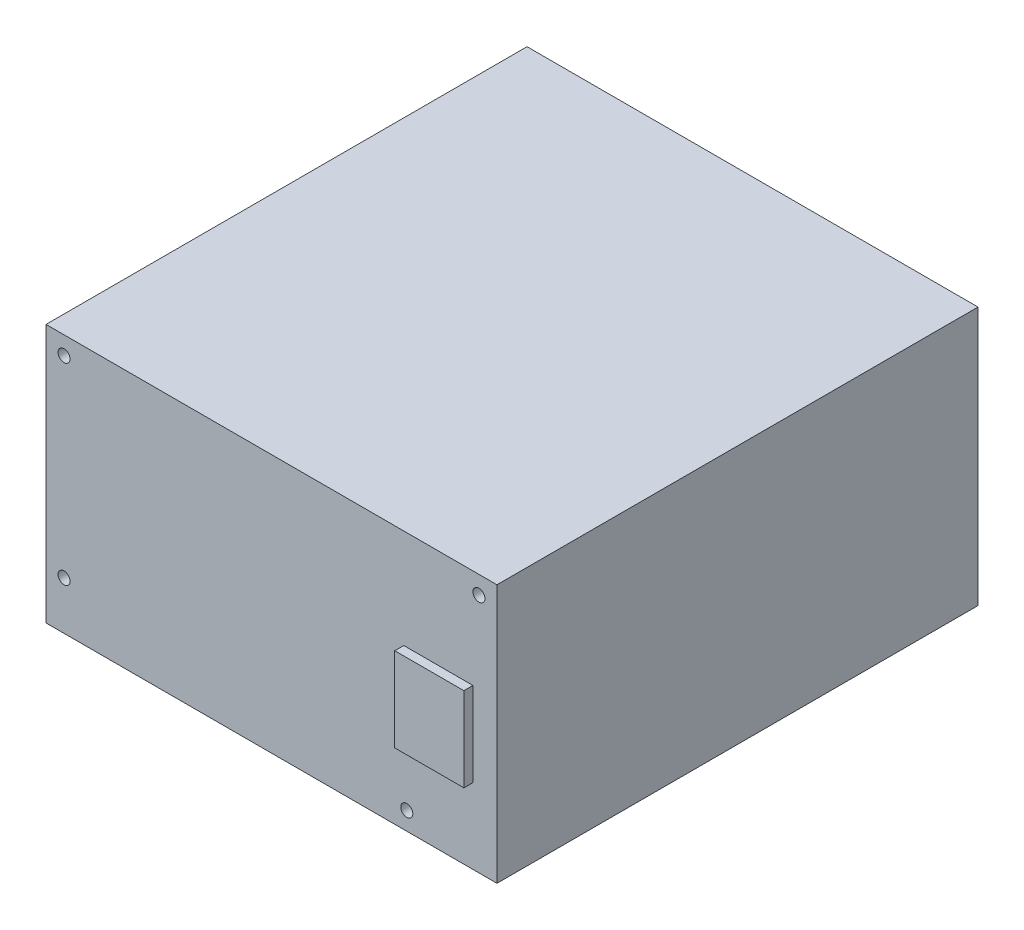
ISO-10303-21;
HEADER;
FILE_DESCRIPTION(('STEP AP214'),'2;1');
FILE_NAME('part.step','',(''),(''),'','','');
FILE_SCHEMA(('AUTOMOTIVE_DESIGN { 1 0 10303 214 1 1 1 1 }'));
ENDSEC;
DATA;
#1=APPLICATION_CONTEXT('core data for automotive mechanical design processes');
#2=APPLICATION_PROTOCOL_DEFINITION('international standard','automotive_design',2000,#1);
#3=PRODUCT_CONTEXT('',#1,'mechanical');
#4=PRODUCT('Part','Part','',(#3));
#5=PRODUCT_RELATED_PRODUCT_CATEGORY('part','',(#4));
#6=PRODUCT_DEFINITION_FORMATION('','',#4);
#7=PRODUCT_DEFINITION_CONTEXT('part definition',#1,'design');
#8=PRODUCT_DEFINITION('design','',#6,#7);
#9=PRODUCT_DEFINITION_SHAPE('','',#8);
#10=(LENGTH_UNIT() NAMED_UNIT(*) SI_UNIT(.MILLI.,.METRE.));
#11=(NAMED_UNIT(*) PLANE_ANGLE_UNIT() SI_UNIT($,.RADIAN.));
#12=(NAMED_UNIT(*) SI_UNIT($,.STERADIAN.) SOLID_ANGLE_UNIT());
#13=UNCERTAINTY_MEASURE_WITH_UNIT(LENGTH_MEASURE(1.E-05),#10,'distance_accuracy_value','');
#14=(GEOMETRIC_REPRESENTATION_CONTEXT(3) GLOBAL_UNCERTAINTY_ASSIGNED_CONTEXT((#13)) GLOBAL_UNIT_ASSIGNED_CONTEXT((#10,
#11,#12)) REPRESENTATION_CONTEXT('',''));
#15=CARTESIAN_POINT('',(0.,0.,0.));
#16=DIRECTION('',(0.,0.,1.));
#17=DIRECTION('',(1.,0.,0.));
#18=AXIS2_PLACEMENT_3D('',#15,#16,#17);
#19=CARTESIAN_POINT('',(150.,86.,0.));
#20=DIRECTION('',(0.,0.,-1.));
#21=DIRECTION('',(-1.,0.,0.));
#22=AXIS2_PLACEMENT_3D('',#19,#20,#21);
#23=PLANE('',#22);
#24=CARTESIAN_POINT('',(6.,16.,0.));
#25=DIRECTION('',(0.,0.,1.));
#26=DIRECTION('',(1.,0.,0.));
#27=AXIS2_PLACEMENT_3D('',#24,#25,#26);
#28=CIRCLE('',#27,2.);
#29=CARTESIAN_POINT('',(8.,16.,0.));
#30=VERTEX_POINT('',#29);
#31=EDGE_CURVE('E273',#30,#30,#28,.T.);
#32=ORIENTED_EDGE('',*,*,#31,.F.);
#33=EDGE_LOOP('',(#32));
#34=FACE_BOUND('',#33,.T.);
#35=DIRECTION('',(0.,-1.,0.));
#36=VECTOR('',#35,1.);
#37=CARTESIAN_POINT('',(119.,25.,0.));
#38=LINE('',#37,#36);
#39=CARTESIAN_POINT('',(119.,53.,0.));
#40=VERTEX_POINT('',#39);
#41=CARTESIAN_POINT('',(119.,25.,0.));
#42=VERTEX_POINT('',#41);
#43=EDGE_CURVE('E132',#40,#42,#38,.T.);
#44=ORIENTED_EDGE('',*,*,#43,.F.);
#45=DIRECTION('',(-1.,0.,0.));
#46=VECTOR('',#45,1.);
#47=CARTESIAN_POINT('',(142.,53.,0.));
#48=LINE('',#47,#46);
#49=CARTESIAN_POINT('',(142.,53.,0.));
#50=VERTEX_POINT('',#49);
#51=EDGE_CURVE('E129',#50,#40,#48,.T.);
#52=ORIENTED_EDGE('',*,*,#51,.F.);
#53=DIRECTION('',(0.,1.,0.));
#54=VECTOR('',#53,1.);
#55=CARTESIAN_POINT('',(142.,25.,0.));
#56=LINE('',#55,#54);
#57=CARTESIAN_POINT('',(142.,25.,0.));
#58=VERTEX_POINT('',#57);
#59=EDGE_CURVE('E65',#58,#50,#56,.T.);
#60=ORIENTED_EDGE('',*,*,#59,.F.);
#61=DIRECTION('',(1.,0.,0.));
#62=VECTOR('',#61,1.);
#63=CARTESIAN_POINT('',(142.,25.,0.));
#64=LINE('',#63,#62);
#65=EDGE_CURVE('E60',#42,#58,#64,.T.);
#66=ORIENTED_EDGE('',*,*,#65,.F.);
#67=EDGE_LOOP('',(#44,#52,#60,#66));
#68=FACE_BOUND('',#67,.T.);
#69=DIRECTION('',(1.,0.,0.));
#70=VECTOR('',#69,1.);
#71=CARTESIAN_POINT('',(150.,0.,0.));
#72=LINE('',#71,#70);
#73=CARTESIAN_POINT('',(0.,0.,0.));
#74=VERTEX_POINT('',#73);
#75=CARTESIAN_POINT('',(150.,0.,0.));
#76=VERTEX_POINT('',#75);
#77=EDGE_CURVE('E150',#74,#76,#72,.T.);
#78=ORIENTED_EDGE('',*,*,#77,.T.);
#79=DIRECTION('',(0.,-1.,0.));
#80=VECTOR('',#79,1.);
#81=CARTESIAN_POINT('',(150.,86.,0.));
#82=LINE('',#81,#80);
#83=CARTESIAN_POINT('',(150.,86.,0.));
#84=VERTEX_POINT('',#83);
#85=EDGE_CURVE('E158',#84,#76,#82,.T.);
#86=ORIENTED_EDGE('',*,*,#85,.F.);
#87=DIRECTION('',(1.,0.,0.));
#88=VECTOR('',#87,1.);
#89=CARTESIAN_POINT('',(150.,86.,0.));
#90=LINE('',#89,#88);
#91=CARTESIAN_POINT('',(0.,86.,0.));
#92=VERTEX_POINT('',#91);
#93=EDGE_CURVE('E156',#92,#84,#90,.T.);
#94=ORIENTED_EDGE('',*,*,#93,.F.);
#95=DIRECTION('',(0.,-1.,0.));
#96=VECTOR('',#95,1.);
#97=CARTESIAN_POINT('',(0.,86.,0.));
#98=LINE('',#97,#96);
#99=EDGE_CURVE('E170',#92,#74,#98,.T.);
#100=ORIENTED_EDGE('',*,*,#99,.T.);
#101=EDGE_LOOP('',(#78,#86,#94,#100));
#102=FACE_BOUND('',#101,.T.);
#103=CARTESIAN_POINT('',(6.00000000000001,80.,0.));
#104=DIRECTION('',(0.,0.,-1.));
#105=DIRECTION('',(-1.,0.,0.));
#106=AXIS2_PLACEMENT_3D('',#103,#104,#105);
#107=CIRCLE('',#106,2.);
#108=CARTESIAN_POINT('',(4.00000000000001,80.,0.));
#109=VERTEX_POINT('',#108);
#110=EDGE_CURVE('E270',#109,#109,#107,.T.);
#111=ORIENTED_EDGE('',*,*,#110,.T.);
#112=EDGE_LOOP('',(#111));
#113=FACE_BOUND('',#112,.T.);
#114=CARTESIAN_POINT('',(120.,6.,0.));
#115=DIRECTION('',(0.,0.,1.));
#116=DIRECTION('',(1.,0.,0.));
#117=AXIS2_PLACEMENT_3D('',#114,#115,#116);
#118=CIRCLE('',#117,2.);
#119=CARTESIAN_POINT('',(122.,6.,0.));
#120=VERTEX_POINT('',#119);
#121=EDGE_CURVE('E289',#120,#120,#118,.T.);
#122=ORIENTED_EDGE('',*,*,#121,.F.);
#123=EDGE_LOOP('',(#122));
#124=FACE_BOUND('',#123,.T.);
#125=CARTESIAN_POINT('',(144.,80.,0.));
#126=DIRECTION('',(0.,0.,1.));
#127=DIRECTION('',(1.,0.,0.));
#128=AXIS2_PLACEMENT_3D('',#125,#126,#127);
#129=CIRCLE('',#128,2.);
#130=CARTESIAN_POINT('',(146.,80.,0.));
#131=VERTEX_POINT('',#130);
#132=EDGE_CURVE('E264',#131,#131,#129,.T.);
#133=ORIENTED_EDGE('',*,*,#132,.F.);
#134=EDGE_LOOP('',(#133));
#135=FACE_BOUND('',#134,.T.);
#136=ADVANCED_FACE('F44',(#34,#68,#102,#113,#124,#135),#23,.F.);
#137=CARTESIAN_POINT('',(150.,86.,-160.));
#138=DIRECTION('',(-1.,0.,0.));
#139=DIRECTION('',(0.,0.,1.));
#140=AXIS2_PLACEMENT_3D('',#137,#138,#139);
#141=PLANE('',#140);
#142=DIRECTION('',(0.,0.,-1.));
#143=VECTOR('',#142,1.);
#144=CARTESIAN_POINT('',(150.,0.,-160.));
#145=LINE('',#144,#143);
#146=CARTESIAN_POINT('',(150.,0.,-160.));
#147=VERTEX_POINT('',#146);
#148=EDGE_CURVE('E134',#76,#147,#145,.T.);
#149=ORIENTED_EDGE('',*,*,#148,.T.);
#150=DIRECTION('',(0.,-1.,0.));
#151=VECTOR('',#150,1.);
#152=CARTESIAN_POINT('',(150.,86.,-160.));
#153=LINE('',#152,#151);
#154=CARTESIAN_POINT('',(150.,86.,-160.));
#155=VERTEX_POINT('',#154);
#156=EDGE_CURVE('E11',#155,#147,#153,.T.);
#157=ORIENTED_EDGE('',*,*,#156,.F.);
#158=DIRECTION('',(0.,0.,-1.));
#159=VECTOR('',#158,1.);
#160=CARTESIAN_POINT('',(150.,86.,-160.));
#161=LINE('',#160,#159);
#162=EDGE_CURVE('E145',#84,#155,#161,.T.);
#163=ORIENTED_EDGE('',*,*,#162,.F.);
#164=ORIENTED_EDGE('',*,*,#85,.T.);
#165=EDGE_LOOP('',(#149,#157,#163,#164));
#166=FACE_BOUND('',#165,.T.);
#167=ADVANCED_FACE('F46',(#166),#141,.F.);
#168=CARTESIAN_POINT('',(150.,86.,-160.));
#169=DIRECTION('',(0.,0.,1.));
#170=DIRECTION('',(1.,0.,0.));
#171=AXIS2_PLACEMENT_3D('',#168,#169,#170);
#172=PLANE('',#171);
#173=DIRECTION('',(-1.,0.,0.));
#174=VECTOR('',#173,1.);
#175=CARTESIAN_POINT('',(150.,0.,-160.));
#176=LINE('',#175,#174);
#177=CARTESIAN_POINT('',(0.,0.,-160.));
#178=VERTEX_POINT('',#177);
#179=EDGE_CURVE('E139',#147,#178,#176,.T.);
#180=ORIENTED_EDGE('',*,*,#179,.T.);
#181=DIRECTION('',(0.,-1.,0.));
#182=VECTOR('',#181,1.);
#183=CARTESIAN_POINT('',(0.,86.,-160.));
#184=LINE('',#183,#182);
#185=CARTESIAN_POINT('',(0.,86.,-160.));
#186=VERTEX_POINT('',#185);
#187=EDGE_CURVE('E53',#186,#178,#184,.T.);
#188=ORIENTED_EDGE('',*,*,#187,.F.);
#189=DIRECTION('',(-1.,0.,0.));
#190=VECTOR('',#189,1.);
#191=CARTESIAN_POINT('',(150.,86.,-160.));
#192=LINE('',#191,#190);
#193=EDGE_CURVE('E149',#155,#186,#192,.T.);
#194=ORIENTED_EDGE('',*,*,#193,.F.);
#195=ORIENTED_EDGE('',*,*,#156,.T.);
#196=EDGE_LOOP('',(#180,#188,#194,#195));
#197=FACE_BOUND('',#196,.T.);
#198=ADVANCED_FACE('F195',(#197),#172,.F.);
#199=CARTESIAN_POINT('',(0.,86.,-160.));
#200=DIRECTION('',(1.,0.,0.));
#201=DIRECTION('',(0.,0.,-1.));
#202=AXIS2_PLACEMENT_3D('',#199,#200,#201);
#203=PLANE('',#202);
#204=DIRECTION('',(0.,0.,1.));
#205=VECTOR('',#204,1.);
#206=CARTESIAN_POINT('',(0.,0.,-160.));
#207=LINE('',#206,#205);
#208=EDGE_CURVE('E162',#178,#74,#207,.T.);
#209=ORIENTED_EDGE('',*,*,#208,.T.);
#210=ORIENTED_EDGE('',*,*,#99,.F.);
#211=DIRECTION('',(0.,0.,1.));
#212=VECTOR('',#211,1.);
#213=CARTESIAN_POINT('',(0.,86.,-160.));
#214=LINE('',#213,#212);
#215=EDGE_CURVE('E153',#186,#92,#214,.T.);
#216=ORIENTED_EDGE('',*,*,#215,.F.);
#217=ORIENTED_EDGE('',*,*,#187,.T.);
#218=EDGE_LOOP('',(#209,#210,#216,#217));
#219=FACE_BOUND('',#218,.T.);
#220=ADVANCED_FACE('F179',(#219),#203,.F.);
#221=CARTESIAN_POINT('',(0.,86.,0.));
#222=DIRECTION('',(0.,-1.,0.));
#223=DIRECTION('',(0.,0.,-1.));
#224=AXIS2_PLACEMENT_3D('',#221,#222,#223);
#225=PLANE('',#224);
#226=ORIENTED_EDGE('',*,*,#162,.T.);
#227=ORIENTED_EDGE('',*,*,#193,.T.);
#228=ORIENTED_EDGE('',*,*,#215,.T.);
#229=ORIENTED_EDGE('',*,*,#93,.T.);
#230=EDGE_LOOP('',(#226,#227,#228,#229));
#231=FACE_BOUND('',#230,.T.);
#232=ADVANCED_FACE('F194',(#231),#225,.F.);
#233=CARTESIAN_POINT('',(0.,0.,0.));
#234=DIRECTION('',(0.,-1.,0.));
#235=DIRECTION('',(0.,0.,-1.));
#236=AXIS2_PLACEMENT_3D('',#233,#234,#235);
#237=PLANE('',#236);
#238=ORIENTED_EDGE('',*,*,#148,.F.);
#239=ORIENTED_EDGE('',*,*,#77,.F.);
#240=ORIENTED_EDGE('',*,*,#208,.F.);
#241=ORIENTED_EDGE('',*,*,#179,.F.);
#242=EDGE_LOOP('',(#238,#239,#240,#241));
#243=FACE_BOUND('',#242,.T.);
#244=ADVANCED_FACE('F185',(#243),#237,.T.);
#245=CARTESIAN_POINT('',(119.,25.,3.));
#246=DIRECTION('',(1.,0.,0.));
#247=DIRECTION('',(0.,0.,-1.));
#248=AXIS2_PLACEMENT_3D('',#245,#246,#247);
#249=PLANE('',#248);
#250=ORIENTED_EDGE('',*,*,#43,.T.);
#251=DIRECTION('',(0.,0.,-1.));
#252=VECTOR('',#251,1.);
#253=CARTESIAN_POINT('',(119.,25.,3.));
#254=LINE('',#253,#252);
#255=CARTESIAN_POINT('',(119.,25.,3.));
#256=VERTEX_POINT('',#255);
#257=EDGE_CURVE('E111',#256,#42,#254,.T.);
#258=ORIENTED_EDGE('',*,*,#257,.F.);
#259=DIRECTION('',(0.,-1.,0.));
#260=VECTOR('',#259,1.);
#261=CARTESIAN_POINT('',(119.,25.,3.));
#262=LINE('',#261,#260);
#263=CARTESIAN_POINT('',(119.,53.,3.));
#264=VERTEX_POINT('',#263);
#265=EDGE_CURVE('E119',#264,#256,#262,.T.);
#266=ORIENTED_EDGE('',*,*,#265,.F.);
#267=DIRECTION('',(0.,0.,-1.));
#268=VECTOR('',#267,1.);
#269=CARTESIAN_POINT('',(119.,53.,3.));
#270=LINE('',#269,#268);
#271=EDGE_CURVE('E299',#264,#40,#270,.T.);
#272=ORIENTED_EDGE('',*,*,#271,.T.);
#273=EDGE_LOOP('',(#250,#258,#266,#272));
#274=FACE_BOUND('',#273,.T.);
#275=ADVANCED_FACE('F131',(#274),#249,.F.);
#276=CARTESIAN_POINT('',(142.,25.,3.));
#277=DIRECTION('',(0.,1.,0.));
#278=DIRECTION('',(0.,0.,1.));
#279=AXIS2_PLACEMENT_3D('',#276,#277,#278);
#280=PLANE('',#279);
#281=ORIENTED_EDGE('',*,*,#65,.T.);
#282=DIRECTION('',(0.,0.,-1.));
#283=VECTOR('',#282,1.);
#284=CARTESIAN_POINT('',(142.,25.,3.));
#285=LINE('',#284,#283);
#286=CARTESIAN_POINT('',(142.,25.,3.));
#287=VERTEX_POINT('',#286);
#288=EDGE_CURVE('E114',#287,#58,#285,.T.);
#289=ORIENTED_EDGE('',*,*,#288,.F.);
#290=DIRECTION('',(1.,0.,0.));
#291=VECTOR('',#290,1.);
#292=CARTESIAN_POINT('',(142.,25.,3.));
#293=LINE('',#292,#291);
#294=EDGE_CURVE('E107',#256,#287,#293,.T.);
#295=ORIENTED_EDGE('',*,*,#294,.F.);
#296=ORIENTED_EDGE('',*,*,#257,.T.);
#297=EDGE_LOOP('',(#281,#289,#295,#296));
#298=FACE_BOUND('',#297,.T.);
#299=ADVANCED_FACE('F109',(#298),#280,.F.);
#300=CARTESIAN_POINT('',(142.,25.,3.));
#301=DIRECTION('',(-1.,0.,0.));
#302=DIRECTION('',(0.,0.,1.));
#303=AXIS2_PLACEMENT_3D('',#300,#301,#302);
#304=PLANE('',#303);
#305=ORIENTED_EDGE('',*,*,#59,.T.);
#306=DIRECTION('',(0.,0.,-1.));
#307=VECTOR('',#306,1.);
#308=CARTESIAN_POINT('',(142.,53.,3.));
#309=LINE('',#308,#307);
#310=CARTESIAN_POINT('',(142.,53.,3.));
#311=VERTEX_POINT('',#310);
#312=EDGE_CURVE('E141',#311,#50,#309,.T.);
#313=ORIENTED_EDGE('',*,*,#312,.F.);
#314=DIRECTION('',(0.,1.,0.));
#315=VECTOR('',#314,1.);
#316=CARTESIAN_POINT('',(142.,25.,3.));
#317=LINE('',#316,#315);
#318=EDGE_CURVE('E118',#287,#311,#317,.T.);
#319=ORIENTED_EDGE('',*,*,#318,.F.);
#320=ORIENTED_EDGE('',*,*,#288,.T.);
#321=EDGE_LOOP('',(#305,#313,#319,#320));
#322=FACE_BOUND('',#321,.T.);
#323=ADVANCED_FACE('F219',(#322),#304,.F.);
#324=CARTESIAN_POINT('',(142.,53.,3.));
#325=DIRECTION('',(0.,-1.,0.));
#326=DIRECTION('',(1.,0.,0.));
#327=AXIS2_PLACEMENT_3D('',#324,#325,#326);
#328=PLANE('',#327);
#329=ORIENTED_EDGE('',*,*,#51,.T.);
#330=ORIENTED_EDGE('',*,*,#271,.F.);
#331=DIRECTION('',(-1.,0.,0.));
#332=VECTOR('',#331,1.);
#333=CARTESIAN_POINT('',(142.,53.,3.));
#334=LINE('',#333,#332);
#335=EDGE_CURVE('E124',#311,#264,#334,.T.);
#336=ORIENTED_EDGE('',*,*,#335,.F.);
#337=ORIENTED_EDGE('',*,*,#312,.T.);
#338=EDGE_LOOP('',(#329,#330,#336,#337));
#339=FACE_BOUND('',#338,.T.);
#340=ADVANCED_FACE('F222',(#339),#328,.F.);
#341=CARTESIAN_POINT('',(0.,0.,3.));
#342=DIRECTION('',(0.,0.,1.));
#343=DIRECTION('',(1.,0.,0.));
#344=AXIS2_PLACEMENT_3D('',#341,#342,#343);
#345=PLANE('',#344);
#346=ORIENTED_EDGE('',*,*,#265,.T.);
#347=ORIENTED_EDGE('',*,*,#294,.T.);
#348=ORIENTED_EDGE('',*,*,#318,.T.);
#349=ORIENTED_EDGE('',*,*,#335,.T.);
#350=EDGE_LOOP('',(#346,#347,#348,#349));
#351=FACE_BOUND('',#350,.T.);
#352=ADVANCED_FACE('F122',(#351),#345,.T.);
#353=CARTESIAN_POINT('',(6.00000000000001,80.,-3.));
#354=DIRECTION('',(0.,0.,1.));
#355=DIRECTION('',(1.,0.,0.));
#356=AXIS2_PLACEMENT_3D('',#353,#354,#355);
#357=CYLINDRICAL_SURFACE('',#356,2.);
#358=CARTESIAN_POINT('',(6.00000000000001,80.,-3.));
#359=DIRECTION('',(0.,0.,-1.));
#360=DIRECTION('',(-1.,0.,0.));
#361=AXIS2_PLACEMENT_3D('',#358,#359,#360);
#362=CIRCLE('',#361,2.);
#363=CARTESIAN_POINT('',(4.00000000000001,80.,-3.));
#364=VERTEX_POINT('',#363);
#365=EDGE_CURVE('E285',#364,#364,#362,.T.);
#366=ORIENTED_EDGE('',*,*,#365,.T.);
#367=EDGE_LOOP('',(#366));
#368=FACE_BOUND('',#367,.T.);
#369=ORIENTED_EDGE('',*,*,#110,.F.);
#370=EDGE_LOOP('',(#369));
#371=FACE_BOUND('',#370,.T.);
#372=ADVANCED_FACE('F228',(#368,#371),#357,.F.);
#373=CARTESIAN_POINT('',(6.00000000000001,80.,-3.));
#374=DIRECTION('',(0.,0.,-1.));
#375=DIRECTION('',(-1.,0.,0.));
#376=AXIS2_PLACEMENT_3D('',#373,#374,#375);
#377=PLANE('',#376);
#378=ORIENTED_EDGE('',*,*,#365,.F.);
#379=EDGE_LOOP('',(#378));
#380=FACE_BOUND('',#379,.T.);
#381=ADVANCED_FACE('F237',(#380),#377,.F.);
#382=CARTESIAN_POINT('',(120.,6.,-3.));
#383=DIRECTION('',(0.,0.,1.));
#384=DIRECTION('',(1.,0.,0.));
#385=AXIS2_PLACEMENT_3D('',#382,#383,#384);
#386=CYLINDRICAL_SURFACE('',#385,2.);
#387=CARTESIAN_POINT('',(120.,6.,-3.));
#388=DIRECTION('',(0.,0.,1.));
#389=DIRECTION('',(1.,0.,0.));
#390=AXIS2_PLACEMENT_3D('',#387,#388,#389);
#391=CIRCLE('',#390,2.);
#392=CARTESIAN_POINT('',(122.,6.,-3.));
#393=VERTEX_POINT('',#392);
#394=EDGE_CURVE('E277',#393,#393,#391,.T.);
#395=ORIENTED_EDGE('',*,*,#394,.F.);
#396=EDGE_LOOP('',(#395));
#397=FACE_BOUND('',#396,.T.);
#398=ORIENTED_EDGE('',*,*,#121,.T.);
#399=EDGE_LOOP('',(#398));
#400=FACE_BOUND('',#399,.T.);
#401=ADVANCED_FACE('F233',(#397,#400),#386,.F.);
#402=CARTESIAN_POINT('',(120.,6.,-3.));
#403=DIRECTION('',(0.,0.,1.));
#404=DIRECTION('',(1.,0.,0.));
#405=AXIS2_PLACEMENT_3D('',#402,#403,#404);
#406=PLANE('',#405);
#407=ORIENTED_EDGE('',*,*,#394,.T.);
#408=EDGE_LOOP('',(#407));
#409=FACE_BOUND('',#408,.T.);
#410=ADVANCED_FACE('F229',(#409),#406,.T.);
#411=CARTESIAN_POINT('',(6.,16.,-3.));
#412=DIRECTION('',(0.,0.,1.));
#413=DIRECTION('',(1.,0.,0.));
#414=AXIS2_PLACEMENT_3D('',#411,#412,#413);
#415=CYLINDRICAL_SURFACE('',#414,2.);
#416=CARTESIAN_POINT('',(6.,16.,-3.));
#417=DIRECTION('',(0.,0.,1.));
#418=DIRECTION('',(1.,0.,0.));
#419=AXIS2_PLACEMENT_3D('',#416,#417,#418);
#420=CIRCLE('',#419,2.);
#421=CARTESIAN_POINT('',(8.,16.,-3.));
#422=VERTEX_POINT('',#421);
#423=EDGE_CURVE('E278',#422,#422,#420,.T.);
#424=ORIENTED_EDGE('',*,*,#423,.F.);
#425=EDGE_LOOP('',(#424));
#426=FACE_BOUND('',#425,.T.);
#427=ORIENTED_EDGE('',*,*,#31,.T.);
#428=EDGE_LOOP('',(#427));
#429=FACE_BOUND('',#428,.T.);
#430=ADVANCED_FACE('F232',(#426,#429),#415,.F.);
#431=CARTESIAN_POINT('',(6.,16.,-3.));
#432=DIRECTION('',(0.,0.,1.));
#433=DIRECTION('',(1.,0.,0.));
#434=AXIS2_PLACEMENT_3D('',#431,#432,#433);
#435=PLANE('',#434);
#436=ORIENTED_EDGE('',*,*,#423,.T.);
#437=EDGE_LOOP('',(#436));
#438=FACE_BOUND('',#437,.T.);
#439=ADVANCED_FACE('F244',(#438),#435,.T.);
#440=CARTESIAN_POINT('',(144.,80.,-3.));
#441=DIRECTION('',(0.,0.,1.));
#442=DIRECTION('',(1.,0.,0.));
#443=AXIS2_PLACEMENT_3D('',#440,#441,#442);
#444=CYLINDRICAL_SURFACE('',#443,2.);
#445=CARTESIAN_POINT('',(144.,80.,-3.));
#446=DIRECTION('',(0.,0.,1.));
#447=DIRECTION('',(1.,0.,0.));
#448=AXIS2_PLACEMENT_3D('',#445,#446,#447);
#449=CIRCLE('',#448,2.);
#450=CARTESIAN_POINT('',(146.,80.,-3.));
#451=VERTEX_POINT('',#450);
#452=EDGE_CURVE('E262',#451,#451,#449,.T.);
#453=ORIENTED_EDGE('',*,*,#452,.F.);
#454=EDGE_LOOP('',(#453));
#455=FACE_BOUND('',#454,.T.);
#456=ORIENTED_EDGE('',*,*,#132,.T.);
#457=EDGE_LOOP('',(#456));
#458=FACE_BOUND('',#457,.T.);
#459=ADVANCED_FACE('F247',(#455,#458),#444,.F.);
#460=CARTESIAN_POINT('',(144.,80.,-3.));
#461=DIRECTION('',(0.,0.,1.));
#462=DIRECTION('',(1.,0.,0.));
#463=AXIS2_PLACEMENT_3D('',#460,#461,#462);
#464=PLANE('',#463);
#465=ORIENTED_EDGE('',*,*,#452,.T.);
#466=EDGE_LOOP('',(#465));
#467=FACE_BOUND('',#466,.T.);
#468=ADVANCED_FACE('F254',(#467),#464,.T.);
#469=CLOSED_SHELL('',(#136,#167,#198,#220,#232,#244,#275,#299,#323,#340,#352,#372,#381,#401,
#410,#430,#439,#459,#468));
#470=MANIFOLD_SOLID_BREP('B2',#469);
#471=ADVANCED_BREP_SHAPE_REPRESENTATION('',(#18,#470),#14);
#472=SHAPE_DEFINITION_REPRESENTATION(#9,#471);
ENDSEC;
END-ISO-10303-21;
